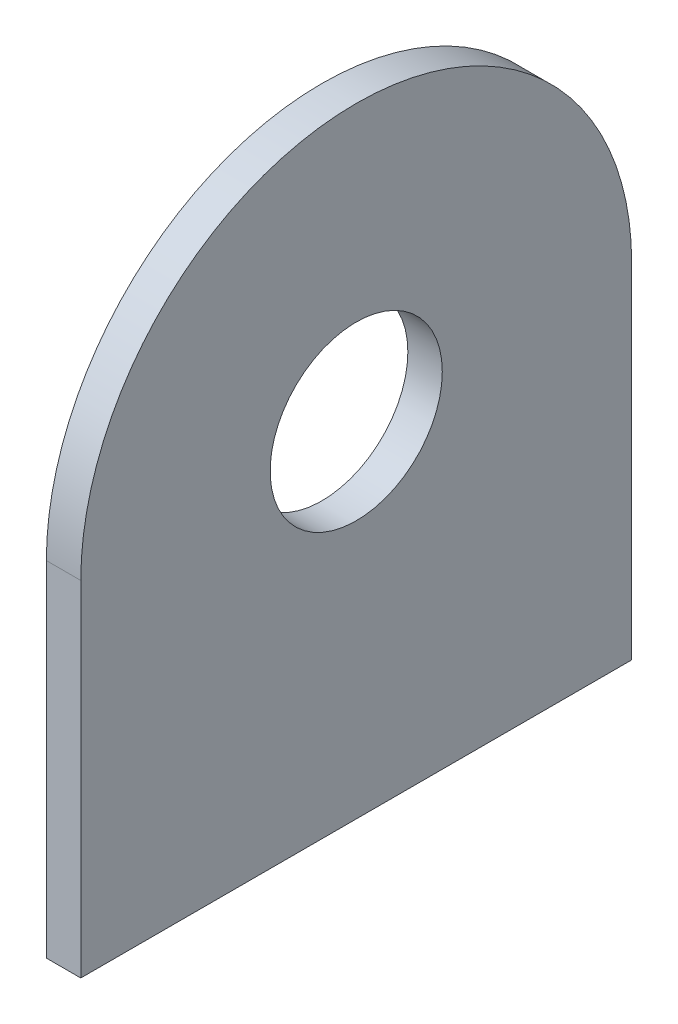
ISO-10303-21;
HEADER;
FILE_DESCRIPTION(('STEP AP214'),'2;1');
FILE_NAME('part.step','',(''),(''),'','','');
FILE_SCHEMA(('AUTOMOTIVE_DESIGN { 1 0 10303 214 1 1 1 1 }'));
ENDSEC;
DATA;
#1=APPLICATION_CONTEXT('core data for automotive mechanical design processes');
#2=APPLICATION_PROTOCOL_DEFINITION('international standard','automotive_design',2000,#1);
#3=PRODUCT_CONTEXT('',#1,'mechanical');
#4=PRODUCT('Part','Part','',(#3));
#5=PRODUCT_RELATED_PRODUCT_CATEGORY('part','',(#4));
#6=PRODUCT_DEFINITION_FORMATION('','',#4);
#7=PRODUCT_DEFINITION_CONTEXT('part definition',#1,'design');
#8=PRODUCT_DEFINITION('design','',#6,#7);
#9=PRODUCT_DEFINITION_SHAPE('','',#8);
#10=(LENGTH_UNIT() NAMED_UNIT(*) SI_UNIT(.MILLI.,.METRE.));
#11=(NAMED_UNIT(*) PLANE_ANGLE_UNIT() SI_UNIT($,.RADIAN.));
#12=(NAMED_UNIT(*) SI_UNIT($,.STERADIAN.) SOLID_ANGLE_UNIT());
#13=UNCERTAINTY_MEASURE_WITH_UNIT(LENGTH_MEASURE(1.E-05),#10,'distance_accuracy_value','');
#14=(GEOMETRIC_REPRESENTATION_CONTEXT(3) GLOBAL_UNCERTAINTY_ASSIGNED_CONTEXT((#13)) GLOBAL_UNIT_ASSIGNED_CONTEXT((#10,
#11,#12)) REPRESENTATION_CONTEXT('',''));
#15=CARTESIAN_POINT('',(0.,0.,0.));
#16=DIRECTION('',(0.,0.,1.));
#17=DIRECTION('',(1.,0.,0.));
#18=AXIS2_PLACEMENT_3D('',#15,#16,#17);
#19=CARTESIAN_POINT('',(3.175,0.,0.));
#20=DIRECTION('',(1.,0.,0.));
#21=DIRECTION('',(0.,0.,-1.));
#22=AXIS2_PLACEMENT_3D('',#19,#20,#21);
#23=PLANE('',#22);
#24=CARTESIAN_POINT('',(3.175,0.,0.));
#25=DIRECTION('',(1.,0.,0.));
#26=DIRECTION('',(0.,0.,-1.));
#27=AXIS2_PLACEMENT_3D('',#24,#25,#26);
#28=CIRCLE('',#27,25.4);
#29=CARTESIAN_POINT('',(3.175,0.,-25.4));
#30=VERTEX_POINT('',#29);
#31=CARTESIAN_POINT('',(3.175,0.,25.4));
#32=VERTEX_POINT('',#31);
#33=EDGE_CURVE('E92',#30,#32,#28,.T.);
#34=ORIENTED_EDGE('',*,*,#33,.T.);
#35=DIRECTION('',(0.,-1.,0.));
#36=VECTOR('',#35,1.);
#37=CARTESIAN_POINT('',(3.175,0.,25.4));
#38=LINE('',#37,#36);
#39=CARTESIAN_POINT('',(3.175,-31.75,25.4));
#40=VERTEX_POINT('',#39);
#41=EDGE_CURVE('E87',#32,#40,#38,.T.);
#42=ORIENTED_EDGE('',*,*,#41,.T.);
#43=DIRECTION('',(0.,0.,-1.));
#44=VECTOR('',#43,1.);
#45=CARTESIAN_POINT('',(3.175,-31.75,25.4));
#46=LINE('',#45,#44);
#47=CARTESIAN_POINT('',(3.175,-31.75,-25.4));
#48=VERTEX_POINT('',#47);
#49=EDGE_CURVE('E90',#40,#48,#46,.T.);
#50=ORIENTED_EDGE('',*,*,#49,.T.);
#51=DIRECTION('',(0.,1.,0.));
#52=VECTOR('',#51,1.);
#53=CARTESIAN_POINT('',(3.175,0.,-25.4));
#54=LINE('',#53,#52);
#55=EDGE_CURVE('E57',#48,#30,#54,.T.);
#56=ORIENTED_EDGE('',*,*,#55,.T.);
#57=EDGE_LOOP('',(#34,#42,#50,#56));
#58=FACE_BOUND('',#57,.T.);
#59=CARTESIAN_POINT('',(3.175,0.,0.));
#60=DIRECTION('',(1.,0.,0.));
#61=DIRECTION('',(0.,0.,-1.));
#62=AXIS2_PLACEMENT_3D('',#59,#60,#61);
#63=CIRCLE('',#62,7.9375);
#64=CARTESIAN_POINT('',(3.175,0.,-7.9375));
#65=VERTEX_POINT('',#64);
#66=EDGE_CURVE('E112',#65,#65,#63,.T.);
#67=ORIENTED_EDGE('',*,*,#66,.F.);
#68=EDGE_LOOP('',(#67));
#69=FACE_BOUND('',#68,.T.);
#70=ADVANCED_FACE('F39',(#58,#69),#23,.T.);
#71=CARTESIAN_POINT('',(0.,0.,0.));
#72=DIRECTION('',(1.,0.,0.));
#73=DIRECTION('',(0.,0.,-1.));
#74=AXIS2_PLACEMENT_3D('',#71,#72,#73);
#75=PLANE('',#74);
#76=CARTESIAN_POINT('',(0.,0.,0.));
#77=DIRECTION('',(1.,0.,0.));
#78=DIRECTION('',(0.,0.,-1.));
#79=AXIS2_PLACEMENT_3D('',#76,#77,#78);
#80=CIRCLE('',#79,25.4);
#81=CARTESIAN_POINT('',(0.,0.,-25.4));
#82=VERTEX_POINT('',#81);
#83=CARTESIAN_POINT('',(0.,0.,25.4));
#84=VERTEX_POINT('',#83);
#85=EDGE_CURVE('E108',#82,#84,#80,.T.);
#86=ORIENTED_EDGE('',*,*,#85,.F.);
#87=DIRECTION('',(0.,1.,0.));
#88=VECTOR('',#87,1.);
#89=CARTESIAN_POINT('',(0.,0.,-25.4));
#90=LINE('',#89,#88);
#91=CARTESIAN_POINT('',(0.,-31.75,-25.4));
#92=VERTEX_POINT('',#91);
#93=EDGE_CURVE('E80',#92,#82,#90,.T.);
#94=ORIENTED_EDGE('',*,*,#93,.F.);
#95=DIRECTION('',(0.,0.,-1.));
#96=VECTOR('',#95,1.);
#97=CARTESIAN_POINT('',(0.,-31.75,25.4));
#98=LINE('',#97,#96);
#99=CARTESIAN_POINT('',(0.,-31.75,25.4));
#100=VERTEX_POINT('',#99);
#101=EDGE_CURVE('E74',#100,#92,#98,.T.);
#102=ORIENTED_EDGE('',*,*,#101,.F.);
#103=DIRECTION('',(0.,-1.,0.));
#104=VECTOR('',#103,1.);
#105=CARTESIAN_POINT('',(0.,0.,25.4));
#106=LINE('',#105,#104);
#107=EDGE_CURVE('E97',#84,#100,#106,.T.);
#108=ORIENTED_EDGE('',*,*,#107,.F.);
#109=EDGE_LOOP('',(#86,#94,#102,#108));
#110=FACE_BOUND('',#109,.T.);
#111=CARTESIAN_POINT('',(0.,0.,0.));
#112=DIRECTION('',(1.,0.,0.));
#113=DIRECTION('',(0.,0.,-1.));
#114=AXIS2_PLACEMENT_3D('',#111,#112,#113);
#115=CIRCLE('',#114,7.9375);
#116=CARTESIAN_POINT('',(0.,0.,-7.9375));
#117=VERTEX_POINT('',#116);
#118=EDGE_CURVE('E130',#117,#117,#115,.T.);
#119=ORIENTED_EDGE('',*,*,#118,.T.);
#120=EDGE_LOOP('',(#119));
#121=FACE_BOUND('',#120,.T.);
#122=ADVANCED_FACE('F125',(#110,#121),#75,.F.);
#123=CARTESIAN_POINT('',(3.175,0.,0.));
#124=DIRECTION('',(-1.,0.,0.));
#125=DIRECTION('',(0.,0.,1.));
#126=AXIS2_PLACEMENT_3D('',#123,#124,#125);
#127=CYLINDRICAL_SURFACE('',#126,25.4);
#128=ORIENTED_EDGE('',*,*,#85,.T.);
#129=DIRECTION('',(-1.,0.,0.));
#130=VECTOR('',#129,1.);
#131=CARTESIAN_POINT('',(3.175,0.,25.4));
#132=LINE('',#131,#130);
#133=EDGE_CURVE('E11',#32,#84,#132,.T.);
#134=ORIENTED_EDGE('',*,*,#133,.F.);
#135=ORIENTED_EDGE('',*,*,#33,.F.);
#136=DIRECTION('',(-1.,0.,0.));
#137=VECTOR('',#136,1.);
#138=CARTESIAN_POINT('',(3.175,0.,-25.4));
#139=LINE('',#138,#137);
#140=EDGE_CURVE('E104',#30,#82,#139,.T.);
#141=ORIENTED_EDGE('',*,*,#140,.T.);
#142=EDGE_LOOP('',(#128,#134,#135,#141));
#143=FACE_BOUND('',#142,.T.);
#144=ADVANCED_FACE('F41',(#143),#127,.T.);
#145=CARTESIAN_POINT('',(3.175,0.,25.4));
#146=DIRECTION('',(0.,0.,-1.));
#147=DIRECTION('',(0.,1.,0.));
#148=AXIS2_PLACEMENT_3D('',#145,#146,#147);
#149=PLANE('',#148);
#150=ORIENTED_EDGE('',*,*,#107,.T.);
#151=DIRECTION('',(-1.,0.,0.));
#152=VECTOR('',#151,1.);
#153=CARTESIAN_POINT('',(3.175,-31.75,25.4));
#154=LINE('',#153,#152);
#155=EDGE_CURVE('E49',#40,#100,#154,.T.);
#156=ORIENTED_EDGE('',*,*,#155,.F.);
#157=ORIENTED_EDGE('',*,*,#41,.F.);
#158=ORIENTED_EDGE('',*,*,#133,.T.);
#159=EDGE_LOOP('',(#150,#156,#157,#158));
#160=FACE_BOUND('',#159,.T.);
#161=ADVANCED_FACE('F96',(#160),#149,.F.);
#162=CARTESIAN_POINT('',(3.175,-31.75,25.4));
#163=DIRECTION('',(0.,1.,0.));
#164=DIRECTION('',(0.,0.,1.));
#165=AXIS2_PLACEMENT_3D('',#162,#163,#164);
#166=PLANE('',#165);
#167=ORIENTED_EDGE('',*,*,#101,.T.);
#168=DIRECTION('',(-1.,0.,0.));
#169=VECTOR('',#168,1.);
#170=CARTESIAN_POINT('',(3.175,-31.75,-25.4));
#171=LINE('',#170,#169);
#172=EDGE_CURVE('E99',#48,#92,#171,.T.);
#173=ORIENTED_EDGE('',*,*,#172,.F.);
#174=ORIENTED_EDGE('',*,*,#49,.F.);
#175=ORIENTED_EDGE('',*,*,#155,.T.);
#176=EDGE_LOOP('',(#167,#173,#174,#175));
#177=FACE_BOUND('',#176,.T.);
#178=ADVANCED_FACE('F100',(#177),#166,.F.);
#179=CARTESIAN_POINT('',(3.175,0.,-25.4));
#180=DIRECTION('',(0.,0.,1.));
#181=DIRECTION('',(0.,-1.,0.));
#182=AXIS2_PLACEMENT_3D('',#179,#180,#181);
#183=PLANE('',#182);
#184=ORIENTED_EDGE('',*,*,#93,.T.);
#185=ORIENTED_EDGE('',*,*,#140,.F.);
#186=ORIENTED_EDGE('',*,*,#55,.F.);
#187=ORIENTED_EDGE('',*,*,#172,.T.);
#188=EDGE_LOOP('',(#184,#185,#186,#187));
#189=FACE_BOUND('',#188,.T.);
#190=ADVANCED_FACE('F122',(#189),#183,.F.);
#191=CARTESIAN_POINT('',(3.175,0.,0.));
#192=DIRECTION('',(-1.,0.,0.));
#193=DIRECTION('',(0.,0.,1.));
#194=AXIS2_PLACEMENT_3D('',#191,#192,#193);
#195=CYLINDRICAL_SURFACE('',#194,7.9375);
#196=ORIENTED_EDGE('',*,*,#66,.T.);
#197=EDGE_LOOP('',(#196));
#198=FACE_BOUND('',#197,.T.);
#199=ORIENTED_EDGE('',*,*,#118,.F.);
#200=EDGE_LOOP('',(#199));
#201=FACE_BOUND('',#200,.T.);
#202=ADVANCED_FACE('F138',(#198,#201),#195,.F.);
#203=CLOSED_SHELL('',(#70,#122,#144,#161,#178,#190,#202));
#204=MANIFOLD_SOLID_BREP('B2',#203);
#205=ADVANCED_BREP_SHAPE_REPRESENTATION('',(#18,#204),#14);
#206=SHAPE_DEFINITION_REPRESENTATION(#9,#205);
ENDSEC;
END-ISO-10303-21;
